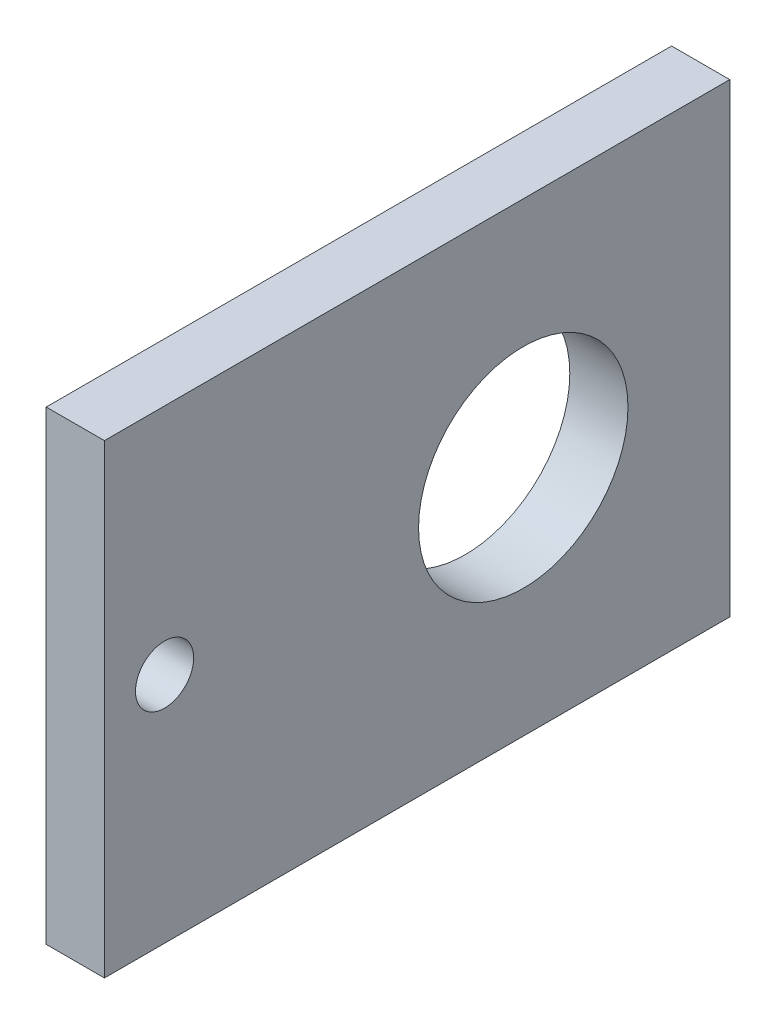
ISO-10303-21;
HEADER;
FILE_DESCRIPTION(('STEP AP214'),'2;1');
FILE_NAME('part.step','',(''),(''),'','','');
FILE_SCHEMA(('AUTOMOTIVE_DESIGN { 1 0 10303 214 1 1 1 1 }'));
ENDSEC;
DATA;
#1=APPLICATION_CONTEXT('core data for automotive mechanical design processes');
#2=APPLICATION_PROTOCOL_DEFINITION('international standard','automotive_design',2000,#1);
#3=PRODUCT_CONTEXT('',#1,'mechanical');
#4=PRODUCT('Part','Part','',(#3));
#5=PRODUCT_RELATED_PRODUCT_CATEGORY('part','',(#4));
#6=PRODUCT_DEFINITION_FORMATION('','',#4);
#7=PRODUCT_DEFINITION_CONTEXT('part definition',#1,'design');
#8=PRODUCT_DEFINITION('design','',#6,#7);
#9=PRODUCT_DEFINITION_SHAPE('','',#8);
#10=(LENGTH_UNIT() NAMED_UNIT(*) SI_UNIT(.MILLI.,.METRE.));
#11=(NAMED_UNIT(*) PLANE_ANGLE_UNIT() SI_UNIT($,.RADIAN.));
#12=(NAMED_UNIT(*) SI_UNIT($,.STERADIAN.) SOLID_ANGLE_UNIT());
#13=UNCERTAINTY_MEASURE_WITH_UNIT(LENGTH_MEASURE(1.E-05),#10,'distance_accuracy_value','');
#14=(GEOMETRIC_REPRESENTATION_CONTEXT(3) GLOBAL_UNCERTAINTY_ASSIGNED_CONTEXT((#13)) GLOBAL_UNIT_ASSIGNED_CONTEXT((#10,
#11,#12)) REPRESENTATION_CONTEXT('',''));
#15=CARTESIAN_POINT('',(0.,0.,0.));
#16=DIRECTION('',(0.,0.,1.));
#17=DIRECTION('',(1.,0.,0.));
#18=AXIS2_PLACEMENT_3D('',#15,#16,#17);
#19=CARTESIAN_POINT('',(5.,0.,0.));
#20=DIRECTION('',(1.,0.,0.));
#21=DIRECTION('',(0.,0.,-1.));
#22=AXIS2_PLACEMENT_3D('',#19,#20,#21);
#23=PLANE('',#22);
#24=CARTESIAN_POINT('',(5.,-20.,-36.));
#25=DIRECTION('',(1.,0.,0.));
#26=DIRECTION('',(0.,0.,-1.));
#27=AXIS2_PLACEMENT_3D('',#24,#25,#26);
#28=CIRCLE('',#27,9.);
#29=CARTESIAN_POINT('',(5.,-20.,-45.));
#30=VERTEX_POINT('',#29);
#31=EDGE_CURVE('E100',#30,#30,#28,.T.);
#32=ORIENTED_EDGE('',*,*,#31,.F.);
#33=EDGE_LOOP('',(#32));
#34=FACE_BOUND('',#33,.T.);
#35=DIRECTION('',(0.,-1.,0.));
#36=VECTOR('',#35,1.);
#37=CARTESIAN_POINT('',(5.,0.,0.));
#38=LINE('',#37,#36);
#39=CARTESIAN_POINT('',(5.,0.,0.));
#40=VERTEX_POINT('',#39);
#41=CARTESIAN_POINT('',(5.,-40.,0.));
#42=VERTEX_POINT('',#41);
#43=EDGE_CURVE('E85',#40,#42,#38,.T.);
#44=ORIENTED_EDGE('',*,*,#43,.T.);
#45=DIRECTION('',(0.,0.,-1.));
#46=VECTOR('',#45,1.);
#47=CARTESIAN_POINT('',(5.,-40.,0.));
#48=LINE('',#47,#46);
#49=CARTESIAN_POINT('',(5.,-40.,-53.7471951520936));
#50=VERTEX_POINT('',#49);
#51=EDGE_CURVE('E80',#42,#50,#48,.T.);
#52=ORIENTED_EDGE('',*,*,#51,.T.);
#53=DIRECTION('',(0.,1.,0.));
#54=VECTOR('',#53,1.);
#55=CARTESIAN_POINT('',(5.,0.,-53.7471951520936));
#56=LINE('',#55,#54);
#57=CARTESIAN_POINT('',(5.,0.,-53.7471951520936));
#58=VERTEX_POINT('',#57);
#59=EDGE_CURVE('E83',#50,#58,#56,.T.);
#60=ORIENTED_EDGE('',*,*,#59,.T.);
#61=DIRECTION('',(0.,0.,1.));
#62=VECTOR('',#61,1.);
#63=CARTESIAN_POINT('',(5.,0.,0.));
#64=LINE('',#63,#62);
#65=EDGE_CURVE('E50',#58,#40,#64,.T.);
#66=ORIENTED_EDGE('',*,*,#65,.T.);
#67=EDGE_LOOP('',(#44,#52,#60,#66));
#68=FACE_BOUND('',#67,.T.);
#69=CARTESIAN_POINT('',(5.,-20.,-5.1690679620687));
#70=DIRECTION('',(1.,0.,0.));
#71=DIRECTION('',(0.,0.,-1.));
#72=AXIS2_PLACEMENT_3D('',#69,#70,#71);
#73=CIRCLE('',#72,2.5);
#74=CARTESIAN_POINT('',(5.,-20.,-7.6690679620687));
#75=VERTEX_POINT('',#74);
#76=EDGE_CURVE('E115',#75,#75,#73,.T.);
#77=ORIENTED_EDGE('',*,*,#76,.F.);
#78=EDGE_LOOP('',(#77));
#79=FACE_BOUND('',#78,.T.);
#80=ADVANCED_FACE('F33',(#34,#68,#79),#23,.T.);
#81=CARTESIAN_POINT('',(0.,0.,0.));
#82=DIRECTION('',(1.,0.,0.));
#83=DIRECTION('',(0.,0.,-1.));
#84=AXIS2_PLACEMENT_3D('',#81,#82,#83);
#85=PLANE('',#84);
#86=DIRECTION('',(0.,-1.,0.));
#87=VECTOR('',#86,1.);
#88=CARTESIAN_POINT('',(0.,0.,0.));
#89=LINE('',#88,#87);
#90=CARTESIAN_POINT('',(0.,0.,0.));
#91=VERTEX_POINT('',#90);
#92=CARTESIAN_POINT('',(0.,-40.,0.));
#93=VERTEX_POINT('',#92);
#94=EDGE_CURVE('E97',#91,#93,#89,.T.);
#95=ORIENTED_EDGE('',*,*,#94,.F.);
#96=DIRECTION('',(0.,0.,1.));
#97=VECTOR('',#96,1.);
#98=CARTESIAN_POINT('',(0.,0.,0.));
#99=LINE('',#98,#97);
#100=CARTESIAN_POINT('',(0.,0.,-53.7471951520936));
#101=VERTEX_POINT('',#100);
#102=EDGE_CURVE('E73',#101,#91,#99,.T.);
#103=ORIENTED_EDGE('',*,*,#102,.F.);
#104=DIRECTION('',(0.,1.,0.));
#105=VECTOR('',#104,1.);
#106=CARTESIAN_POINT('',(0.,0.,-53.7471951520936));
#107=LINE('',#106,#105);
#108=CARTESIAN_POINT('',(0.,-40.,-53.7471951520936));
#109=VERTEX_POINT('',#108);
#110=EDGE_CURVE('E67',#109,#101,#107,.T.);
#111=ORIENTED_EDGE('',*,*,#110,.F.);
#112=DIRECTION('',(0.,0.,-1.));
#113=VECTOR('',#112,1.);
#114=CARTESIAN_POINT('',(0.,-40.,0.));
#115=LINE('',#114,#113);
#116=EDGE_CURVE('E89',#93,#109,#115,.T.);
#117=ORIENTED_EDGE('',*,*,#116,.F.);
#118=EDGE_LOOP('',(#95,#103,#111,#117));
#119=FACE_BOUND('',#118,.T.);
#120=CARTESIAN_POINT('',(0.,-20.,-36.));
#121=DIRECTION('',(1.,0.,0.));
#122=DIRECTION('',(0.,0.,-1.));
#123=AXIS2_PLACEMENT_3D('',#120,#121,#122);
#124=CIRCLE('',#123,9.);
#125=CARTESIAN_POINT('',(0.,-20.,-45.));
#126=VERTEX_POINT('',#125);
#127=EDGE_CURVE('E112',#126,#126,#124,.T.);
#128=ORIENTED_EDGE('',*,*,#127,.T.);
#129=EDGE_LOOP('',(#128));
#130=FACE_BOUND('',#129,.T.);
#131=CARTESIAN_POINT('',(0.,-20.,-5.1690679620687));
#132=DIRECTION('',(1.,0.,0.));
#133=DIRECTION('',(0.,0.,-1.));
#134=AXIS2_PLACEMENT_3D('',#131,#132,#133);
#135=CIRCLE('',#134,2.5);
#136=CARTESIAN_POINT('',(0.,-20.,-7.6690679620687));
#137=VERTEX_POINT('',#136);
#138=EDGE_CURVE('E118',#137,#137,#135,.T.);
#139=ORIENTED_EDGE('',*,*,#138,.T.);
#140=EDGE_LOOP('',(#139));
#141=FACE_BOUND('',#140,.T.);
#142=ADVANCED_FACE('F108',(#119,#130,#141),#85,.F.);
#143=CARTESIAN_POINT('',(5.,0.,0.));
#144=DIRECTION('',(0.,0.,-1.));
#145=DIRECTION('',(0.,1.,0.));
#146=AXIS2_PLACEMENT_3D('',#143,#144,#145);
#147=PLANE('',#146);
#148=ORIENTED_EDGE('',*,*,#94,.T.);
#149=DIRECTION('',(-1.,0.,0.));
#150=VECTOR('',#149,1.);
#151=CARTESIAN_POINT('',(5.,-40.,0.));
#152=LINE('',#151,#150);
#153=EDGE_CURVE('E11',#42,#93,#152,.T.);
#154=ORIENTED_EDGE('',*,*,#153,.F.);
#155=ORIENTED_EDGE('',*,*,#43,.F.);
#156=DIRECTION('',(-1.,0.,0.));
#157=VECTOR('',#156,1.);
#158=CARTESIAN_POINT('',(5.,0.,0.));
#159=LINE('',#158,#157);
#160=EDGE_CURVE('E93',#40,#91,#159,.T.);
#161=ORIENTED_EDGE('',*,*,#160,.T.);
#162=EDGE_LOOP('',(#148,#154,#155,#161));
#163=FACE_BOUND('',#162,.T.);
#164=ADVANCED_FACE('F35',(#163),#147,.F.);
#165=CARTESIAN_POINT('',(5.,-40.,0.));
#166=DIRECTION('',(0.,1.,0.));
#167=DIRECTION('',(0.,0.,1.));
#168=AXIS2_PLACEMENT_3D('',#165,#166,#167);
#169=PLANE('',#168);
#170=ORIENTED_EDGE('',*,*,#116,.T.);
#171=DIRECTION('',(-1.,0.,0.));
#172=VECTOR('',#171,1.);
#173=CARTESIAN_POINT('',(5.,-40.,-53.7471951520936));
#174=LINE('',#173,#172);
#175=EDGE_CURVE('E42',#50,#109,#174,.T.);
#176=ORIENTED_EDGE('',*,*,#175,.F.);
#177=ORIENTED_EDGE('',*,*,#51,.F.);
#178=ORIENTED_EDGE('',*,*,#153,.T.);
#179=EDGE_LOOP('',(#170,#176,#177,#178));
#180=FACE_BOUND('',#179,.T.);
#181=ADVANCED_FACE('F88',(#180),#169,.F.);
#182=CARTESIAN_POINT('',(5.,0.,-53.7471951520936));
#183=DIRECTION('',(0.,0.,1.));
#184=DIRECTION('',(1.,0.,0.));
#185=AXIS2_PLACEMENT_3D('',#182,#183,#184);
#186=PLANE('',#185);
#187=ORIENTED_EDGE('',*,*,#110,.T.);
#188=DIRECTION('',(-1.,0.,0.));
#189=VECTOR('',#188,1.);
#190=CARTESIAN_POINT('',(5.,0.,-53.7471951520936));
#191=LINE('',#190,#189);
#192=EDGE_CURVE('E90',#58,#101,#191,.T.);
#193=ORIENTED_EDGE('',*,*,#192,.F.);
#194=ORIENTED_EDGE('',*,*,#59,.F.);
#195=ORIENTED_EDGE('',*,*,#175,.T.);
#196=EDGE_LOOP('',(#187,#193,#194,#195));
#197=FACE_BOUND('',#196,.T.);
#198=ADVANCED_FACE('F91',(#197),#186,.F.);
#199=CARTESIAN_POINT('',(5.,0.,0.));
#200=DIRECTION('',(0.,-1.,0.));
#201=DIRECTION('',(0.,0.,-1.));
#202=AXIS2_PLACEMENT_3D('',#199,#200,#201);
#203=PLANE('',#202);
#204=ORIENTED_EDGE('',*,*,#102,.T.);
#205=ORIENTED_EDGE('',*,*,#160,.F.);
#206=ORIENTED_EDGE('',*,*,#65,.F.);
#207=ORIENTED_EDGE('',*,*,#192,.T.);
#208=EDGE_LOOP('',(#204,#205,#206,#207));
#209=FACE_BOUND('',#208,.T.);
#210=ADVANCED_FACE('F105',(#209),#203,.F.);
#211=CARTESIAN_POINT('',(5.,-20.,-36.));
#212=DIRECTION('',(-1.,0.,0.));
#213=DIRECTION('',(0.,0.,1.));
#214=AXIS2_PLACEMENT_3D('',#211,#212,#213);
#215=CYLINDRICAL_SURFACE('',#214,9.);
#216=ORIENTED_EDGE('',*,*,#31,.T.);
#217=EDGE_LOOP('',(#216));
#218=FACE_BOUND('',#217,.T.);
#219=ORIENTED_EDGE('',*,*,#127,.F.);
#220=EDGE_LOOP('',(#219));
#221=FACE_BOUND('',#220,.T.);
#222=ADVANCED_FACE('F135',(#218,#221),#215,.F.);
#223=CARTESIAN_POINT('',(5.,-20.,-5.1690679620687));
#224=DIRECTION('',(-1.,0.,0.));
#225=DIRECTION('',(0.,0.,1.));
#226=AXIS2_PLACEMENT_3D('',#223,#224,#225);
#227=CYLINDRICAL_SURFACE('',#226,2.5);
#228=ORIENTED_EDGE('',*,*,#76,.T.);
#229=EDGE_LOOP('',(#228));
#230=FACE_BOUND('',#229,.T.);
#231=ORIENTED_EDGE('',*,*,#138,.F.);
#232=EDGE_LOOP('',(#231));
#233=FACE_BOUND('',#232,.T.);
#234=ADVANCED_FACE('F124',(#230,#233),#227,.F.);
#235=CLOSED_SHELL('',(#80,#142,#164,#181,#198,#210,#222,#234));
#236=MANIFOLD_SOLID_BREP('B2',#235);
#237=ADVANCED_BREP_SHAPE_REPRESENTATION('',(#18,#236),#14);
#238=SHAPE_DEFINITION_REPRESENTATION(#9,#237);
ENDSEC;
END-ISO-10303-21;
